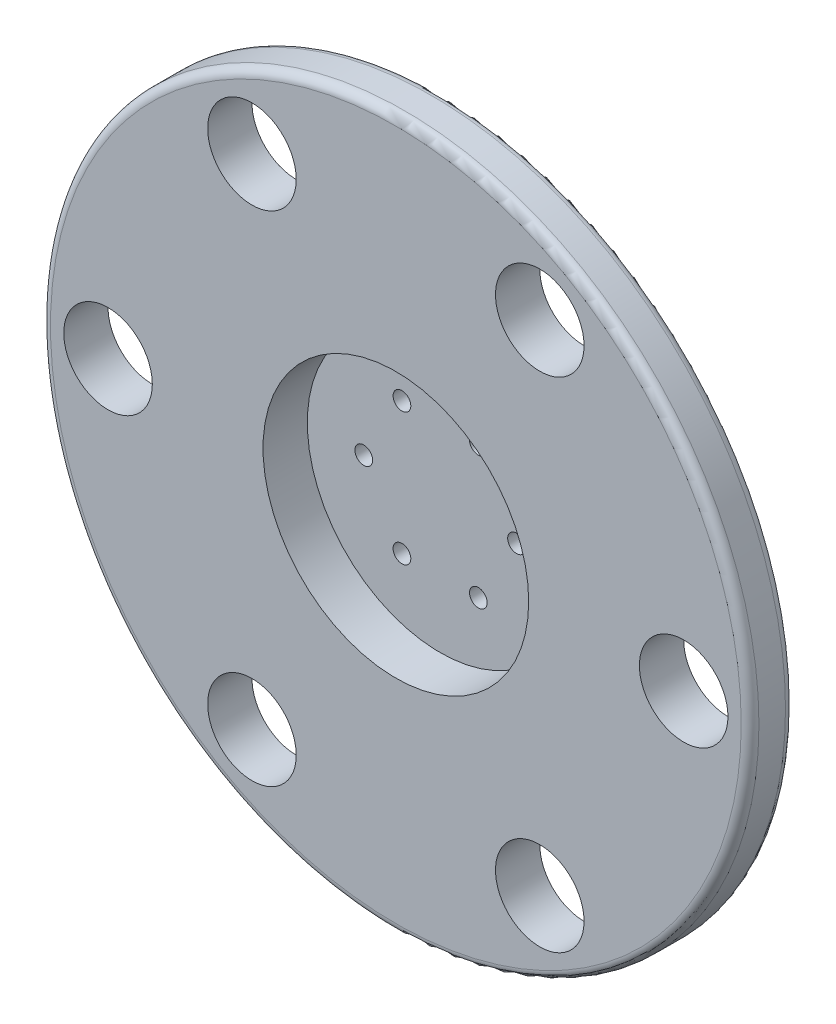
ISO-10303-21;
HEADER;
FILE_DESCRIPTION(('STEP AP214'),'2;1');
FILE_NAME('part.step','',(''),(''),'','','');
FILE_SCHEMA(('AUTOMOTIVE_DESIGN { 1 0 10303 214 1 1 1 1 }'));
ENDSEC;
DATA;
#1=APPLICATION_CONTEXT('core data for automotive mechanical design processes');
#2=APPLICATION_PROTOCOL_DEFINITION('international standard','automotive_design',2000,#1);
#3=PRODUCT_CONTEXT('',#1,'mechanical');
#4=PRODUCT('Part','Part','',(#3));
#5=PRODUCT_RELATED_PRODUCT_CATEGORY('part','',(#4));
#6=PRODUCT_DEFINITION_FORMATION('','',#4);
#7=PRODUCT_DEFINITION_CONTEXT('part definition',#1,'design');
#8=PRODUCT_DEFINITION('design','',#6,#7);
#9=PRODUCT_DEFINITION_SHAPE('','',#8);
#10=(LENGTH_UNIT() NAMED_UNIT(*) SI_UNIT(.MILLI.,.METRE.));
#11=(NAMED_UNIT(*) PLANE_ANGLE_UNIT() SI_UNIT($,.RADIAN.));
#12=(NAMED_UNIT(*) SI_UNIT($,.STERADIAN.) SOLID_ANGLE_UNIT());
#13=UNCERTAINTY_MEASURE_WITH_UNIT(LENGTH_MEASURE(1.E-05),#10,'distance_accuracy_value','');
#14=(GEOMETRIC_REPRESENTATION_CONTEXT(3) GLOBAL_UNCERTAINTY_ASSIGNED_CONTEXT((#13)) GLOBAL_UNIT_ASSIGNED_CONTEXT((#10,
#11,#12)) REPRESENTATION_CONTEXT('',''));
#15=CARTESIAN_POINT('',(0.,0.,0.));
#16=DIRECTION('',(0.,0.,1.));
#17=DIRECTION('',(1.,0.,0.));
#18=AXIS2_PLACEMENT_3D('',#15,#16,#17);
#19=CARTESIAN_POINT('',(0.,0.,10.));
#20=DIRECTION('',(0.,0.,-1.));
#21=DIRECTION('',(-1.,0.,0.));
#22=AXIS2_PLACEMENT_3D('',#19,#20,#21);
#23=CYLINDRICAL_SURFACE('',#22,80.);
#24=CARTESIAN_POINT('',(0.,0.,8.));
#25=DIRECTION('',(0.,0.,1.));
#26=DIRECTION('',(1.,0.,0.));
#27=AXIS2_PLACEMENT_3D('',#24,#25,#26);
#28=CIRCLE('',#27,80.);
#29=CARTESIAN_POINT('',(80.,0.,8.));
#30=VERTEX_POINT('',#29);
#31=EDGE_CURVE('E48',#30,#30,#28,.F.);
#32=ORIENTED_EDGE('',*,*,#31,.T.);
#33=EDGE_LOOP('',(#32));
#34=FACE_BOUND('',#33,.T.);
#35=CARTESIAN_POINT('',(0.,0.,2.));
#36=DIRECTION('',(0.,0.,1.));
#37=DIRECTION('',(1.,0.,0.));
#38=AXIS2_PLACEMENT_3D('',#35,#36,#37);
#39=CIRCLE('',#38,80.);
#40=CARTESIAN_POINT('',(80.,0.,2.));
#41=VERTEX_POINT('',#40);
#42=EDGE_CURVE('E53',#41,#41,#39,.T.);
#43=ORIENTED_EDGE('',*,*,#42,.T.);
#44=EDGE_LOOP('',(#43));
#45=FACE_BOUND('',#44,.T.);
#46=ADVANCED_FACE('F40',(#34,#45),#23,.T.);
#47=CARTESIAN_POINT('',(0.,0.,10.));
#48=DIRECTION('',(0.,0.,1.));
#49=DIRECTION('',(1.,0.,0.));
#50=AXIS2_PLACEMENT_3D('',#47,#48,#49);
#51=PLANE('',#50);
#52=CARTESIAN_POINT('',(0.,0.,10.));
#53=DIRECTION('',(0.,0.,1.));
#54=DIRECTION('',(1.,0.,0.));
#55=AXIS2_PLACEMENT_3D('',#52,#53,#54);
#56=CIRCLE('',#55,78.);
#57=CARTESIAN_POINT('',(78.,0.,10.));
#58=VERTEX_POINT('',#57);
#59=EDGE_CURVE('E58',#58,#58,#56,.T.);
#60=ORIENTED_EDGE('',*,*,#59,.T.);
#61=EDGE_LOOP('',(#60));
#62=FACE_BOUND('',#61,.T.);
#63=CARTESIAN_POINT('',(-65.,0.,10.));
#64=DIRECTION('',(0.,0.,1.));
#65=DIRECTION('',(1.,0.,0.));
#66=AXIS2_PLACEMENT_3D('',#63,#64,#65);
#67=CIRCLE('',#66,10.);
#68=CARTESIAN_POINT('',(-55.,0.,10.));
#69=VERTEX_POINT('',#68);
#70=EDGE_CURVE('E125',#69,#69,#67,.T.);
#71=ORIENTED_EDGE('',*,*,#70,.F.);
#72=EDGE_LOOP('',(#71));
#73=FACE_BOUND('',#72,.T.);
#74=CARTESIAN_POINT('',(-32.5000000000007,-56.2916512459882,10.));
#75=DIRECTION('',(0.,0.,1.));
#76=DIRECTION('',(1.,0.,0.));
#77=AXIS2_PLACEMENT_3D('',#74,#75,#76);
#78=CIRCLE('',#77,10.);
#79=CARTESIAN_POINT('',(-22.5000000000006,-56.2916512459882,10.));
#80=VERTEX_POINT('',#79);
#81=EDGE_CURVE('E163',#80,#80,#78,.T.);
#82=ORIENTED_EDGE('',*,*,#81,.F.);
#83=EDGE_LOOP('',(#82));
#84=FACE_BOUND('',#83,.T.);
#85=CARTESIAN_POINT('',(32.4999999999995,-56.2916512459888,10.));
#86=DIRECTION('',(0.,0.,1.));
#87=DIRECTION('',(1.,0.,0.));
#88=AXIS2_PLACEMENT_3D('',#85,#86,#87);
#89=CIRCLE('',#88,10.);
#90=CARTESIAN_POINT('',(42.4999999999995,-56.2916512459888,10.));
#91=VERTEX_POINT('',#90);
#92=EDGE_CURVE('E129',#91,#91,#89,.T.);
#93=ORIENTED_EDGE('',*,*,#92,.F.);
#94=EDGE_LOOP('',(#93));
#95=FACE_BOUND('',#94,.T.);
#96=CARTESIAN_POINT('',(65.,-4.45932369855149E-13,10.));
#97=DIRECTION('',(0.,0.,1.));
#98=DIRECTION('',(1.,0.,0.));
#99=AXIS2_PLACEMENT_3D('',#96,#97,#98);
#100=CIRCLE('',#99,10.);
#101=CARTESIAN_POINT('',(75.,-4.45932369855149E-13,10.));
#102=VERTEX_POINT('',#101);
#103=EDGE_CURVE('E138',#102,#102,#100,.T.);
#104=ORIENTED_EDGE('',*,*,#103,.F.);
#105=EDGE_LOOP('',(#104));
#106=FACE_BOUND('',#105,.T.);
#107=CARTESIAN_POINT('',(32.5000000000003,56.2916512459884,10.));
#108=DIRECTION('',(0.,0.,1.));
#109=DIRECTION('',(1.,0.,0.));
#110=AXIS2_PLACEMENT_3D('',#107,#108,#109);
#111=CIRCLE('',#110,10.);
#112=CARTESIAN_POINT('',(42.5000000000003,56.2916512459884,10.));
#113=VERTEX_POINT('',#112);
#114=EDGE_CURVE('E146',#113,#113,#111,.T.);
#115=ORIENTED_EDGE('',*,*,#114,.F.);
#116=EDGE_LOOP('',(#115));
#117=FACE_BOUND('',#116,.T.);
#118=CARTESIAN_POINT('',(-32.4999999999999,56.2916512459886,10.));
#119=DIRECTION('',(0.,0.,1.));
#120=DIRECTION('',(1.,0.,0.));
#121=AXIS2_PLACEMENT_3D('',#118,#119,#120);
#122=CIRCLE('',#121,10.);
#123=CARTESIAN_POINT('',(-22.4999999999999,56.2916512459886,10.));
#124=VERTEX_POINT('',#123);
#125=EDGE_CURVE('E154',#124,#124,#122,.T.);
#126=ORIENTED_EDGE('',*,*,#125,.F.);
#127=EDGE_LOOP('',(#126));
#128=FACE_BOUND('',#127,.T.);
#129=CARTESIAN_POINT('',(0.,0.,10.));
#130=DIRECTION('',(0.,0.,1.));
#131=DIRECTION('',(1.,0.,0.));
#132=AXIS2_PLACEMENT_3D('',#129,#130,#131);
#133=CIRCLE('',#132,30.);
#134=CARTESIAN_POINT('',(30.,0.,10.));
#135=VERTEX_POINT('',#134);
#136=EDGE_CURVE('E92',#135,#135,#133,.T.);
#137=ORIENTED_EDGE('',*,*,#136,.F.);
#138=EDGE_LOOP('',(#137));
#139=FACE_BOUND('',#138,.T.);
#140=ADVANCED_FACE('F180',(#62,#73,#84,#95,#106,#117,#128,#139),#51,.T.);
#141=CARTESIAN_POINT('',(0.,0.,0.));
#142=DIRECTION('',(0.,0.,1.));
#143=DIRECTION('',(1.,0.,0.));
#144=AXIS2_PLACEMENT_3D('',#141,#142,#143);
#145=PLANE('',#144);
#146=CARTESIAN_POINT('',(0.,0.,0.));
#147=DIRECTION('',(0.,0.,1.));
#148=DIRECTION('',(1.,0.,0.));
#149=AXIS2_PLACEMENT_3D('',#146,#147,#148);
#150=CIRCLE('',#149,78.);
#151=CARTESIAN_POINT('',(78.,0.,0.));
#152=VERTEX_POINT('',#151);
#153=EDGE_CURVE('E10',#152,#152,#150,.F.);
#154=ORIENTED_EDGE('',*,*,#153,.T.);
#155=EDGE_LOOP('',(#154));
#156=FACE_BOUND('',#155,.T.);
#157=CARTESIAN_POINT('',(-65.,0.,0.));
#158=DIRECTION('',(0.,0.,1.));
#159=DIRECTION('',(1.,0.,0.));
#160=AXIS2_PLACEMENT_3D('',#157,#158,#159);
#161=CIRCLE('',#160,10.);
#162=CARTESIAN_POINT('',(-55.,0.,0.));
#163=VERTEX_POINT('',#162);
#164=EDGE_CURVE('E162',#163,#163,#161,.T.);
#165=ORIENTED_EDGE('',*,*,#164,.T.);
#166=EDGE_LOOP('',(#165));
#167=FACE_BOUND('',#166,.T.);
#168=CARTESIAN_POINT('',(-32.5000000000007,-56.2916512459882,0.));
#169=DIRECTION('',(0.,0.,1.));
#170=DIRECTION('',(1.,0.,0.));
#171=AXIS2_PLACEMENT_3D('',#168,#169,#170);
#172=CIRCLE('',#171,10.);
#173=CARTESIAN_POINT('',(-22.5000000000006,-56.2916512459882,0.));
#174=VERTEX_POINT('',#173);
#175=EDGE_CURVE('E134',#174,#174,#172,.T.);
#176=ORIENTED_EDGE('',*,*,#175,.T.);
#177=EDGE_LOOP('',(#176));
#178=FACE_BOUND('',#177,.T.);
#179=CARTESIAN_POINT('',(32.4999999999995,-56.2916512459888,0.));
#180=DIRECTION('',(0.,0.,1.));
#181=DIRECTION('',(1.,0.,0.));
#182=AXIS2_PLACEMENT_3D('',#179,#180,#181);
#183=CIRCLE('',#182,10.);
#184=CARTESIAN_POINT('',(42.4999999999995,-56.2916512459888,0.));
#185=VERTEX_POINT('',#184);
#186=EDGE_CURVE('E133',#185,#185,#183,.T.);
#187=ORIENTED_EDGE('',*,*,#186,.T.);
#188=EDGE_LOOP('',(#187));
#189=FACE_BOUND('',#188,.T.);
#190=CARTESIAN_POINT('',(65.,-4.45932369855149E-13,0.));
#191=DIRECTION('',(0.,0.,1.));
#192=DIRECTION('',(1.,0.,0.));
#193=AXIS2_PLACEMENT_3D('',#190,#191,#192);
#194=CIRCLE('',#193,10.);
#195=CARTESIAN_POINT('',(75.,-4.45932369855149E-13,0.));
#196=VERTEX_POINT('',#195);
#197=EDGE_CURVE('E142',#196,#196,#194,.T.);
#198=ORIENTED_EDGE('',*,*,#197,.T.);
#199=EDGE_LOOP('',(#198));
#200=FACE_BOUND('',#199,.T.);
#201=CARTESIAN_POINT('',(32.5000000000003,56.2916512459884,0.));
#202=DIRECTION('',(0.,0.,1.));
#203=DIRECTION('',(1.,0.,0.));
#204=AXIS2_PLACEMENT_3D('',#201,#202,#203);
#205=CIRCLE('',#204,10.);
#206=CARTESIAN_POINT('',(42.5000000000003,56.2916512459884,0.));
#207=VERTEX_POINT('',#206);
#208=EDGE_CURVE('E150',#207,#207,#205,.T.);
#209=ORIENTED_EDGE('',*,*,#208,.T.);
#210=EDGE_LOOP('',(#209));
#211=FACE_BOUND('',#210,.T.);
#212=CARTESIAN_POINT('',(-32.4999999999999,56.2916512459886,0.));
#213=DIRECTION('',(0.,0.,1.));
#214=DIRECTION('',(1.,0.,0.));
#215=AXIS2_PLACEMENT_3D('',#212,#213,#214);
#216=CIRCLE('',#215,10.);
#217=CARTESIAN_POINT('',(-22.4999999999999,56.2916512459886,0.));
#218=VERTEX_POINT('',#217);
#219=EDGE_CURVE('E158',#218,#218,#216,.T.);
#220=ORIENTED_EDGE('',*,*,#219,.T.);
#221=EDGE_LOOP('',(#220));
#222=FACE_BOUND('',#221,.T.);
#223=CARTESIAN_POINT('',(0.,0.,0.));
#224=DIRECTION('',(0.,0.,1.));
#225=DIRECTION('',(1.,0.,0.));
#226=AXIS2_PLACEMENT_3D('',#223,#224,#225);
#227=CIRCLE('',#226,32.5);
#228=CARTESIAN_POINT('',(32.5,0.,0.));
#229=VERTEX_POINT('',#228);
#230=EDGE_CURVE('E65',#229,#229,#227,.T.);
#231=ORIENTED_EDGE('',*,*,#230,.T.);
#232=EDGE_LOOP('',(#231));
#233=FACE_BOUND('',#232,.T.);
#234=ADVANCED_FACE('F183',(#156,#167,#178,#189,#200,#211,#222,#233),#145,.F.);
#235=CARTESIAN_POINT('',(0.,0.,-10.));
#236=DIRECTION('',(0.,0.,1.));
#237=DIRECTION('',(1.,0.,0.));
#238=AXIS2_PLACEMENT_3D('',#235,#236,#237);
#239=CYLINDRICAL_SURFACE('',#238,32.5);
#240=CARTESIAN_POINT('',(0.,0.,-10.));
#241=DIRECTION('',(0.,0.,1.));
#242=DIRECTION('',(1.,0.,0.));
#243=AXIS2_PLACEMENT_3D('',#240,#241,#242);
#244=CIRCLE('',#243,32.5);
#245=CARTESIAN_POINT('',(32.5,0.,-10.));
#246=VERTEX_POINT('',#245);
#247=EDGE_CURVE('E64',#246,#246,#244,.T.);
#248=ORIENTED_EDGE('',*,*,#247,.T.);
#249=EDGE_LOOP('',(#248));
#250=FACE_BOUND('',#249,.T.);
#251=ORIENTED_EDGE('',*,*,#230,.F.);
#252=EDGE_LOOP('',(#251));
#253=FACE_BOUND('',#252,.T.);
#254=ADVANCED_FACE('F259',(#250,#253),#239,.T.);
#255=CARTESIAN_POINT('',(0.,0.,-10.));
#256=DIRECTION('',(0.,0.,1.));
#257=DIRECTION('',(1.,0.,0.));
#258=AXIS2_PLACEMENT_3D('',#255,#256,#257);
#259=PLANE('',#258);
#260=CARTESIAN_POINT('',(-17.25,0.,-10.));
#261=DIRECTION('',(0.,0.,1.));
#262=DIRECTION('',(1.,0.,0.));
#263=AXIS2_PLACEMENT_3D('',#260,#261,#262);
#264=CIRCLE('',#263,2.);
#265=CARTESIAN_POINT('',(-15.25,0.,-10.));
#266=VERTEX_POINT('',#265);
#267=EDGE_CURVE('E77',#266,#266,#264,.T.);
#268=ORIENTED_EDGE('',*,*,#267,.T.);
#269=EDGE_LOOP('',(#268));
#270=FACE_BOUND('',#269,.T.);
#271=CARTESIAN_POINT('',(-8.62500000000018,-14.9389382152815,-10.));
#272=DIRECTION('',(0.,0.,1.));
#273=DIRECTION('',(1.,0.,0.));
#274=AXIS2_PLACEMENT_3D('',#271,#272,#273);
#275=CIRCLE('',#274,2.);
#276=CARTESIAN_POINT('',(-6.62500000000018,-14.9389382152815,-10.));
#277=VERTEX_POINT('',#276);
#278=EDGE_CURVE('E86',#277,#277,#275,.T.);
#279=ORIENTED_EDGE('',*,*,#278,.T.);
#280=EDGE_LOOP('',(#279));
#281=FACE_BOUND('',#280,.T.);
#282=CARTESIAN_POINT('',(8.62499999999986,-14.9389382152816,-10.));
#283=DIRECTION('',(0.,0.,1.));
#284=DIRECTION('',(1.,0.,0.));
#285=AXIS2_PLACEMENT_3D('',#282,#283,#284);
#286=CIRCLE('',#285,2.);
#287=CARTESIAN_POINT('',(10.6249999999999,-14.9389382152816,-10.));
#288=VERTEX_POINT('',#287);
#289=EDGE_CURVE('E96',#288,#288,#286,.T.);
#290=ORIENTED_EDGE('',*,*,#289,.T.);
#291=EDGE_LOOP('',(#290));
#292=FACE_BOUND('',#291,.T.);
#293=CARTESIAN_POINT('',(17.25,-1.20456106190088E-13,-10.));
#294=DIRECTION('',(0.,0.,1.));
#295=DIRECTION('',(1.,0.,0.));
#296=AXIS2_PLACEMENT_3D('',#293,#294,#295);
#297=CIRCLE('',#296,2.);
#298=CARTESIAN_POINT('',(19.25,-1.20456106190088E-13,-10.));
#299=VERTEX_POINT('',#298);
#300=EDGE_CURVE('E104',#299,#299,#297,.T.);
#301=ORIENTED_EDGE('',*,*,#300,.T.);
#302=EDGE_LOOP('',(#301));
#303=FACE_BOUND('',#302,.T.);
#304=CARTESIAN_POINT('',(8.62500000000007,14.9389382152815,-10.));
#305=DIRECTION('',(0.,0.,1.));
#306=DIRECTION('',(1.,0.,0.));
#307=AXIS2_PLACEMENT_3D('',#304,#305,#306);
#308=CIRCLE('',#307,2.);
#309=CARTESIAN_POINT('',(10.6250000000001,14.9389382152815,-10.));
#310=VERTEX_POINT('',#309);
#311=EDGE_CURVE('E82',#310,#310,#308,.T.);
#312=ORIENTED_EDGE('',*,*,#311,.T.);
#313=EDGE_LOOP('',(#312));
#314=FACE_BOUND('',#313,.T.);
#315=CARTESIAN_POINT('',(-8.62499999999997,14.9389382152816,-10.));
#316=DIRECTION('',(0.,0.,1.));
#317=DIRECTION('',(1.,0.,0.));
#318=AXIS2_PLACEMENT_3D('',#315,#316,#317);
#319=CIRCLE('',#318,2.);
#320=CARTESIAN_POINT('',(-6.62499999999997,14.9389382152816,-10.));
#321=VERTEX_POINT('',#320);
#322=EDGE_CURVE('E69',#321,#321,#319,.T.);
#323=ORIENTED_EDGE('',*,*,#322,.T.);
#324=EDGE_LOOP('',(#323));
#325=FACE_BOUND('',#324,.T.);
#326=ORIENTED_EDGE('',*,*,#247,.F.);
#327=EDGE_LOOP('',(#326));
#328=FACE_BOUND('',#327,.T.);
#329=ADVANCED_FACE('F269',(#270,#281,#292,#303,#314,#325,#328),#259,.F.);
#330=CARTESIAN_POINT('',(-8.62499999999997,14.9389382152816,-10.));
#331=DIRECTION('',(0.,0.,1.));
#332=DIRECTION('',(1.,0.,0.));
#333=AXIS2_PLACEMENT_3D('',#330,#331,#332);
#334=CYLINDRICAL_SURFACE('',#333,2.);
#335=ORIENTED_EDGE('',*,*,#322,.F.);
#336=EDGE_LOOP('',(#335));
#337=FACE_BOUND('',#336,.T.);
#338=CARTESIAN_POINT('',(-8.62499999999997,14.9389382152816,0.));
#339=DIRECTION('',(0.,0.,1.));
#340=DIRECTION('',(1.,0.,0.));
#341=AXIS2_PLACEMENT_3D('',#338,#339,#340);
#342=CIRCLE('',#341,2.);
#343=CARTESIAN_POINT('',(-6.62499999999997,14.9389382152816,0.));
#344=VERTEX_POINT('',#343);
#345=EDGE_CURVE('E73',#344,#344,#342,.T.);
#346=ORIENTED_EDGE('',*,*,#345,.T.);
#347=EDGE_LOOP('',(#346));
#348=FACE_BOUND('',#347,.T.);
#349=ADVANCED_FACE('F276',(#337,#348),#334,.F.);
#350=CARTESIAN_POINT('',(8.62500000000007,14.9389382152815,-10.));
#351=DIRECTION('',(0.,0.,1.));
#352=DIRECTION('',(1.,0.,0.));
#353=AXIS2_PLACEMENT_3D('',#350,#351,#352);
#354=CYLINDRICAL_SURFACE('',#353,2.);
#355=ORIENTED_EDGE('',*,*,#311,.F.);
#356=EDGE_LOOP('',(#355));
#357=FACE_BOUND('',#356,.T.);
#358=CARTESIAN_POINT('',(8.62500000000007,14.9389382152815,0.));
#359=DIRECTION('',(0.,0.,1.));
#360=DIRECTION('',(1.,0.,0.));
#361=AXIS2_PLACEMENT_3D('',#358,#359,#360);
#362=CIRCLE('',#361,2.);
#363=CARTESIAN_POINT('',(10.6250000000001,14.9389382152815,0.));
#364=VERTEX_POINT('',#363);
#365=EDGE_CURVE('E78',#364,#364,#362,.T.);
#366=ORIENTED_EDGE('',*,*,#365,.T.);
#367=EDGE_LOOP('',(#366));
#368=FACE_BOUND('',#367,.T.);
#369=ADVANCED_FACE('F282',(#357,#368),#354,.F.);
#370=CARTESIAN_POINT('',(17.25,-1.20456106190088E-13,-10.));
#371=DIRECTION('',(0.,0.,1.));
#372=DIRECTION('',(1.,0.,0.));
#373=AXIS2_PLACEMENT_3D('',#370,#371,#372);
#374=CYLINDRICAL_SURFACE('',#373,2.);
#375=ORIENTED_EDGE('',*,*,#300,.F.);
#376=EDGE_LOOP('',(#375));
#377=FACE_BOUND('',#376,.T.);
#378=CARTESIAN_POINT('',(17.25,-1.20456106190088E-13,0.));
#379=DIRECTION('',(0.,0.,1.));
#380=DIRECTION('',(1.,0.,0.));
#381=AXIS2_PLACEMENT_3D('',#378,#379,#380);
#382=CIRCLE('',#381,2.);
#383=CARTESIAN_POINT('',(19.25,-1.20456106190088E-13,0.));
#384=VERTEX_POINT('',#383);
#385=EDGE_CURVE('E108',#384,#384,#382,.T.);
#386=ORIENTED_EDGE('',*,*,#385,.T.);
#387=EDGE_LOOP('',(#386));
#388=FACE_BOUND('',#387,.T.);
#389=ADVANCED_FACE('F294',(#377,#388),#374,.F.);
#390=CARTESIAN_POINT('',(8.62499999999986,-14.9389382152816,-10.));
#391=DIRECTION('',(0.,0.,1.));
#392=DIRECTION('',(1.,0.,0.));
#393=AXIS2_PLACEMENT_3D('',#390,#391,#392);
#394=CYLINDRICAL_SURFACE('',#393,2.);
#395=ORIENTED_EDGE('',*,*,#289,.F.);
#396=EDGE_LOOP('',(#395));
#397=FACE_BOUND('',#396,.T.);
#398=CARTESIAN_POINT('',(8.62499999999986,-14.9389382152816,0.));
#399=DIRECTION('',(0.,0.,1.));
#400=DIRECTION('',(1.,0.,0.));
#401=AXIS2_PLACEMENT_3D('',#398,#399,#400);
#402=CIRCLE('',#401,2.);
#403=CARTESIAN_POINT('',(10.6249999999999,-14.9389382152816,0.));
#404=VERTEX_POINT('',#403);
#405=EDGE_CURVE('E100',#404,#404,#402,.T.);
#406=ORIENTED_EDGE('',*,*,#405,.T.);
#407=EDGE_LOOP('',(#406));
#408=FACE_BOUND('',#407,.T.);
#409=ADVANCED_FACE('F290',(#397,#408),#394,.F.);
#410=CARTESIAN_POINT('',(-8.62500000000018,-14.9389382152815,-10.));
#411=DIRECTION('',(0.,0.,1.));
#412=DIRECTION('',(1.,0.,0.));
#413=AXIS2_PLACEMENT_3D('',#410,#411,#412);
#414=CYLINDRICAL_SURFACE('',#413,2.);
#415=ORIENTED_EDGE('',*,*,#278,.F.);
#416=EDGE_LOOP('',(#415));
#417=FACE_BOUND('',#416,.T.);
#418=CARTESIAN_POINT('',(-8.62500000000018,-14.9389382152815,0.));
#419=DIRECTION('',(0.,0.,1.));
#420=DIRECTION('',(1.,0.,0.));
#421=AXIS2_PLACEMENT_3D('',#418,#419,#420);
#422=CIRCLE('',#421,2.);
#423=CARTESIAN_POINT('',(-6.62500000000018,-14.9389382152815,0.));
#424=VERTEX_POINT('',#423);
#425=EDGE_CURVE('E91',#424,#424,#422,.T.);
#426=ORIENTED_EDGE('',*,*,#425,.T.);
#427=EDGE_LOOP('',(#426));
#428=FACE_BOUND('',#427,.T.);
#429=ADVANCED_FACE('F286',(#417,#428),#414,.F.);
#430=CARTESIAN_POINT('',(-17.25,0.,-10.));
#431=DIRECTION('',(0.,0.,1.));
#432=DIRECTION('',(1.,0.,0.));
#433=AXIS2_PLACEMENT_3D('',#430,#431,#432);
#434=CYLINDRICAL_SURFACE('',#433,2.);
#435=ORIENTED_EDGE('',*,*,#267,.F.);
#436=EDGE_LOOP('',(#435));
#437=FACE_BOUND('',#436,.T.);
#438=CARTESIAN_POINT('',(-17.25,0.,0.));
#439=DIRECTION('',(0.,0.,1.));
#440=DIRECTION('',(1.,0.,0.));
#441=AXIS2_PLACEMENT_3D('',#438,#439,#440);
#442=CIRCLE('',#441,2.);
#443=CARTESIAN_POINT('',(-15.25,0.,0.));
#444=VERTEX_POINT('',#443);
#445=EDGE_CURVE('E87',#444,#444,#442,.T.);
#446=ORIENTED_EDGE('',*,*,#445,.T.);
#447=EDGE_LOOP('',(#446));
#448=FACE_BOUND('',#447,.T.);
#449=ADVANCED_FACE('F202',(#437,#448),#434,.F.);
#450=CARTESIAN_POINT('',(0.,0.,10.));
#451=DIRECTION('',(0.,0.,-1.));
#452=DIRECTION('',(-1.,0.,0.));
#453=AXIS2_PLACEMENT_3D('',#450,#451,#452);
#454=CYLINDRICAL_SURFACE('',#453,30.);
#455=ORIENTED_EDGE('',*,*,#136,.T.);
#456=EDGE_LOOP('',(#455));
#457=FACE_BOUND('',#456,.T.);
#458=CARTESIAN_POINT('',(0.,0.,0.));
#459=DIRECTION('',(0.,0.,1.));
#460=DIRECTION('',(1.,0.,0.));
#461=AXIS2_PLACEMENT_3D('',#458,#459,#460);
#462=CIRCLE('',#461,30.);
#463=CARTESIAN_POINT('',(30.,0.,0.));
#464=VERTEX_POINT('',#463);
#465=EDGE_CURVE('E121',#464,#464,#462,.T.);
#466=ORIENTED_EDGE('',*,*,#465,.F.);
#467=EDGE_LOOP('',(#466));
#468=FACE_BOUND('',#467,.T.);
#469=ADVANCED_FACE('F198',(#457,#468),#454,.F.);
#470=CARTESIAN_POINT('',(0.,0.,0.));
#471=DIRECTION('',(0.,0.,1.));
#472=DIRECTION('',(1.,0.,0.));
#473=AXIS2_PLACEMENT_3D('',#470,#471,#472);
#474=PLANE('',#473);
#475=ORIENTED_EDGE('',*,*,#345,.F.);
#476=EDGE_LOOP('',(#475));
#477=FACE_BOUND('',#476,.T.);
#478=ORIENTED_EDGE('',*,*,#365,.F.);
#479=EDGE_LOOP('',(#478));
#480=FACE_BOUND('',#479,.T.);
#481=ORIENTED_EDGE('',*,*,#385,.F.);
#482=EDGE_LOOP('',(#481));
#483=FACE_BOUND('',#482,.T.);
#484=ORIENTED_EDGE('',*,*,#405,.F.);
#485=EDGE_LOOP('',(#484));
#486=FACE_BOUND('',#485,.T.);
#487=ORIENTED_EDGE('',*,*,#425,.F.);
#488=EDGE_LOOP('',(#487));
#489=FACE_BOUND('',#488,.T.);
#490=ORIENTED_EDGE('',*,*,#445,.F.);
#491=EDGE_LOOP('',(#490));
#492=FACE_BOUND('',#491,.T.);
#493=ORIENTED_EDGE('',*,*,#465,.T.);
#494=EDGE_LOOP('',(#493));
#495=FACE_BOUND('',#494,.T.);
#496=ADVANCED_FACE('F201',(#477,#480,#483,#486,#489,#492,#495),#474,.T.);
#497=CARTESIAN_POINT('',(-32.4999999999999,56.2916512459886,10.));
#498=DIRECTION('',(0.,0.,-1.));
#499=DIRECTION('',(-1.,0.,0.));
#500=AXIS2_PLACEMENT_3D('',#497,#498,#499);
#501=CYLINDRICAL_SURFACE('',#500,10.);
#502=ORIENTED_EDGE('',*,*,#125,.T.);
#503=EDGE_LOOP('',(#502));
#504=FACE_BOUND('',#503,.T.);
#505=ORIENTED_EDGE('',*,*,#219,.F.);
#506=EDGE_LOOP('',(#505));
#507=FACE_BOUND('',#506,.T.);
#508=ADVANCED_FACE('F207',(#504,#507),#501,.F.);
#509=CARTESIAN_POINT('',(32.5000000000003,56.2916512459884,10.));
#510=DIRECTION('',(0.,0.,-1.));
#511=DIRECTION('',(-1.,0.,0.));
#512=AXIS2_PLACEMENT_3D('',#509,#510,#511);
#513=CYLINDRICAL_SURFACE('',#512,10.);
#514=ORIENTED_EDGE('',*,*,#114,.T.);
#515=EDGE_LOOP('',(#514));
#516=FACE_BOUND('',#515,.T.);
#517=ORIENTED_EDGE('',*,*,#208,.F.);
#518=EDGE_LOOP('',(#517));
#519=FACE_BOUND('',#518,.T.);
#520=ADVANCED_FACE('F213',(#516,#519),#513,.F.);
#521=CARTESIAN_POINT('',(65.,-4.45932369855149E-13,10.));
#522=DIRECTION('',(0.,0.,-1.));
#523=DIRECTION('',(-1.,0.,0.));
#524=AXIS2_PLACEMENT_3D('',#521,#522,#523);
#525=CYLINDRICAL_SURFACE('',#524,10.);
#526=ORIENTED_EDGE('',*,*,#103,.T.);
#527=EDGE_LOOP('',(#526));
#528=FACE_BOUND('',#527,.T.);
#529=ORIENTED_EDGE('',*,*,#197,.F.);
#530=EDGE_LOOP('',(#529));
#531=FACE_BOUND('',#530,.T.);
#532=ADVANCED_FACE('F246',(#528,#531),#525,.F.);
#533=CARTESIAN_POINT('',(32.4999999999995,-56.2916512459888,10.));
#534=DIRECTION('',(0.,0.,-1.));
#535=DIRECTION('',(-1.,0.,0.));
#536=AXIS2_PLACEMENT_3D('',#533,#534,#535);
#537=CYLINDRICAL_SURFACE('',#536,10.);
#538=ORIENTED_EDGE('',*,*,#92,.T.);
#539=EDGE_LOOP('',(#538));
#540=FACE_BOUND('',#539,.T.);
#541=ORIENTED_EDGE('',*,*,#186,.F.);
#542=EDGE_LOOP('',(#541));
#543=FACE_BOUND('',#542,.T.);
#544=ADVANCED_FACE('F240',(#540,#543),#537,.F.);
#545=CARTESIAN_POINT('',(-32.5000000000007,-56.2916512459882,10.));
#546=DIRECTION('',(0.,0.,-1.));
#547=DIRECTION('',(-1.,0.,0.));
#548=AXIS2_PLACEMENT_3D('',#545,#546,#547);
#549=CYLINDRICAL_SURFACE('',#548,10.);
#550=ORIENTED_EDGE('',*,*,#81,.T.);
#551=EDGE_LOOP('',(#550));
#552=FACE_BOUND('',#551,.T.);
#553=ORIENTED_EDGE('',*,*,#175,.F.);
#554=EDGE_LOOP('',(#553));
#555=FACE_BOUND('',#554,.T.);
#556=ADVANCED_FACE('F234',(#552,#555),#549,.F.);
#557=CARTESIAN_POINT('',(-65.,0.,10.));
#558=DIRECTION('',(0.,0.,-1.));
#559=DIRECTION('',(-1.,0.,0.));
#560=AXIS2_PLACEMENT_3D('',#557,#558,#559);
#561=CYLINDRICAL_SURFACE('',#560,10.);
#562=ORIENTED_EDGE('',*,*,#70,.T.);
#563=EDGE_LOOP('',(#562));
#564=FACE_BOUND('',#563,.T.);
#565=ORIENTED_EDGE('',*,*,#164,.F.);
#566=EDGE_LOOP('',(#565));
#567=FACE_BOUND('',#566,.T.);
#568=ADVANCED_FACE('F177',(#564,#567),#561,.F.);
#569=CARTESIAN_POINT('',(0.,0.,8.));
#570=DIRECTION('',(0.,0.,1.));
#571=DIRECTION('',(1.,0.,0.));
#572=AXIS2_PLACEMENT_3D('',#569,#570,#571);
#573=TOROIDAL_SURFACE('',#572,78.,2.);
#574=ORIENTED_EDGE('',*,*,#31,.F.);
#575=EDGE_LOOP('',(#574));
#576=FACE_BOUND('',#575,.T.);
#577=ORIENTED_EDGE('',*,*,#59,.F.);
#578=EDGE_LOOP('',(#577));
#579=FACE_BOUND('',#578,.T.);
#580=ADVANCED_FACE('F226',(#576,#579),#573,.T.);
#581=CARTESIAN_POINT('',(0.,0.,2.));
#582=DIRECTION('',(0.,0.,1.));
#583=DIRECTION('',(1.,0.,0.));
#584=AXIS2_PLACEMENT_3D('',#581,#582,#583);
#585=TOROIDAL_SURFACE('',#584,78.,2.);
#586=ORIENTED_EDGE('',*,*,#153,.F.);
#587=EDGE_LOOP('',(#586));
#588=FACE_BOUND('',#587,.T.);
#589=ORIENTED_EDGE('',*,*,#42,.F.);
#590=EDGE_LOOP('',(#589));
#591=FACE_BOUND('',#590,.T.);
#592=ADVANCED_FACE('F42',(#588,#591),#585,.T.);
#593=CLOSED_SHELL('',(#46,#140,#234,#254,#329,#349,#369,#389,#409,#429,#449,#469,#496,#508,#520,
#532,#544,#556,#568,#580,#592));
#594=MANIFOLD_SOLID_BREP('B2',#593);
#595=ADVANCED_BREP_SHAPE_REPRESENTATION('',(#18,#594),#14);
#596=SHAPE_DEFINITION_REPRESENTATION(#9,#595);
ENDSEC;
END-ISO-10303-21;
